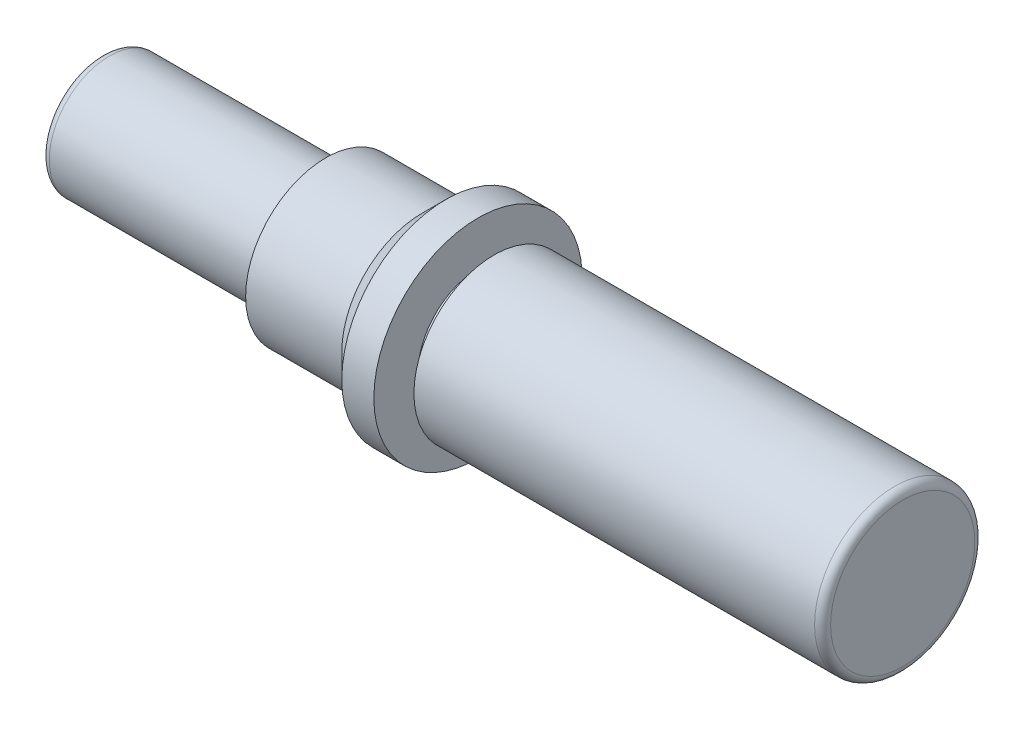
ISO-10303-21;
HEADER;
FILE_DESCRIPTION(('STEP AP214'),'2;1');
FILE_NAME('part.step','',(''),(''),'','','');
FILE_SCHEMA(('AUTOMOTIVE_DESIGN { 1 0 10303 214 1 1 1 1 }'));
ENDSEC;
DATA;
#1=APPLICATION_CONTEXT('core data for automotive mechanical design processes');
#2=APPLICATION_PROTOCOL_DEFINITION('international standard','automotive_design',2000,#1);
#3=PRODUCT_CONTEXT('',#1,'mechanical');
#4=PRODUCT('Part','Part','',(#3));
#5=PRODUCT_RELATED_PRODUCT_CATEGORY('part','',(#4));
#6=PRODUCT_DEFINITION_FORMATION('','',#4);
#7=PRODUCT_DEFINITION_CONTEXT('part definition',#1,'design');
#8=PRODUCT_DEFINITION('design','',#6,#7);
#9=PRODUCT_DEFINITION_SHAPE('','',#8);
#10=(LENGTH_UNIT() NAMED_UNIT(*) SI_UNIT(.MILLI.,.METRE.));
#11=(NAMED_UNIT(*) PLANE_ANGLE_UNIT() SI_UNIT($,.RADIAN.));
#12=(NAMED_UNIT(*) SI_UNIT($,.STERADIAN.) SOLID_ANGLE_UNIT());
#13=UNCERTAINTY_MEASURE_WITH_UNIT(LENGTH_MEASURE(1.E-05),#10,'distance_accuracy_value','');
#14=(GEOMETRIC_REPRESENTATION_CONTEXT(3) GLOBAL_UNCERTAINTY_ASSIGNED_CONTEXT((#13)) GLOBAL_UNIT_ASSIGNED_CONTEXT((#10,
#11,#12)) REPRESENTATION_CONTEXT('',''));
#15=CARTESIAN_POINT('',(0.,0.,0.));
#16=DIRECTION('',(0.,0.,1.));
#17=DIRECTION('',(1.,0.,0.));
#18=AXIS2_PLACEMENT_3D('',#15,#16,#17);
#19=CARTESIAN_POINT('',(-61.6997640195075,9.89779965995193,0.));
#20=DIRECTION('',(1.,0.,0.));
#21=DIRECTION('',(0.,0.,-1.));
#22=AXIS2_PLACEMENT_3D('',#19,#20,#21);
#23=PLANE('',#22);
#24=CARTESIAN_POINT('',(-61.6997640195075,9.89779965995193,0.));
#25=DIRECTION('',(1.,0.,0.));
#26=DIRECTION('',(0.,0.,-1.));
#27=AXIS2_PLACEMENT_3D('',#24,#25,#26);
#28=CIRCLE('',#27,6.5);
#29=CARTESIAN_POINT('',(-61.6997640195075,9.89779965995193,-6.5));
#30=VERTEX_POINT('',#29);
#31=EDGE_CURVE('E49',#30,#30,#28,.F.);
#32=ORIENTED_EDGE('',*,*,#31,.T.);
#33=EDGE_LOOP('',(#32));
#34=FACE_BOUND('',#33,.T.);
#35=ADVANCED_FACE('F41',(#34),#23,.F.);
#36=CARTESIAN_POINT('',(-61.6997640195075,9.89779965995193,0.));
#37=DIRECTION('',(-1.,0.,0.));
#38=DIRECTION('',(0.,0.,1.));
#39=AXIS2_PLACEMENT_3D('',#36,#37,#38);
#40=CYLINDRICAL_SURFACE('',#39,7.5);
#41=CARTESIAN_POINT('',(-60.6997640195075,9.89779965995193,0.));
#42=DIRECTION('',(1.,0.,0.));
#43=DIRECTION('',(0.,0.,-1.));
#44=AXIS2_PLACEMENT_3D('',#41,#42,#43);
#45=CIRCLE('',#44,7.5);
#46=CARTESIAN_POINT('',(-60.6997640195075,9.89779965995193,-7.5));
#47=VERTEX_POINT('',#46);
#48=EDGE_CURVE('E10',#47,#47,#45,.T.);
#49=ORIENTED_EDGE('',*,*,#48,.T.);
#50=EDGE_LOOP('',(#49));
#51=FACE_BOUND('',#50,.T.);
#52=CARTESIAN_POINT('',(-33.6997640195075,9.89779965995193,0.));
#53=DIRECTION('',(-1.,0.,0.));
#54=DIRECTION('',(0.,0.,1.));
#55=AXIS2_PLACEMENT_3D('',#52,#53,#54);
#56=CIRCLE('',#55,7.5);
#57=CARTESIAN_POINT('',(-33.6997640195075,9.89779965995193,7.5));
#58=VERTEX_POINT('',#57);
#59=EDGE_CURVE('E65',#58,#58,#56,.T.);
#60=ORIENTED_EDGE('',*,*,#59,.T.);
#61=EDGE_LOOP('',(#60));
#62=FACE_BOUND('',#61,.T.);
#63=ADVANCED_FACE('F116',(#51,#62),#40,.T.);
#64=CARTESIAN_POINT('',(-33.6997640195075,17.3977996599519,0.));
#65=DIRECTION('',(1.,0.,0.));
#66=DIRECTION('',(0.,0.,-1.));
#67=AXIS2_PLACEMENT_3D('',#64,#65,#66);
#68=PLANE('',#67);
#69=ORIENTED_EDGE('',*,*,#59,.F.);
#70=EDGE_LOOP('',(#69));
#71=FACE_BOUND('',#70,.T.);
#72=CARTESIAN_POINT('',(-33.6997640195075,9.89779965995193,0.));
#73=DIRECTION('',(-1.,0.,0.));
#74=DIRECTION('',(0.,0.,1.));
#75=AXIS2_PLACEMENT_3D('',#72,#73,#74);
#76=CIRCLE('',#75,10.);
#77=CARTESIAN_POINT('',(-33.6997640195075,9.89779965995193,10.));
#78=VERTEX_POINT('',#77);
#79=EDGE_CURVE('E69',#78,#78,#76,.T.);
#80=ORIENTED_EDGE('',*,*,#79,.T.);
#81=EDGE_LOOP('',(#80));
#82=FACE_BOUND('',#81,.T.);
#83=ADVANCED_FACE('F121',(#71,#82),#68,.F.);
#84=CARTESIAN_POINT('',(-61.6997640195075,9.89779965995193,0.));
#85=DIRECTION('',(-1.,0.,0.));
#86=DIRECTION('',(0.,0.,1.));
#87=AXIS2_PLACEMENT_3D('',#84,#85,#86);
#88=CYLINDRICAL_SURFACE('',#87,10.);
#89=ORIENTED_EDGE('',*,*,#79,.F.);
#90=EDGE_LOOP('',(#89));
#91=FACE_BOUND('',#90,.T.);
#92=CARTESIAN_POINT('',(-21.6997640195075,9.89779965995193,0.));
#93=DIRECTION('',(-1.,0.,0.));
#94=DIRECTION('',(0.,0.,1.));
#95=AXIS2_PLACEMENT_3D('',#92,#93,#94);
#96=CIRCLE('',#95,10.);
#97=CARTESIAN_POINT('',(-21.6997640195075,9.89779965995193,10.));
#98=VERTEX_POINT('',#97);
#99=EDGE_CURVE('E73',#98,#98,#96,.T.);
#100=ORIENTED_EDGE('',*,*,#99,.T.);
#101=EDGE_LOOP('',(#100));
#102=FACE_BOUND('',#101,.T.);
#103=ADVANCED_FACE('F217',(#91,#102),#88,.T.);
#104=CARTESIAN_POINT('',(-18.6997640195075,9.89779965995193,0.));
#105=DIRECTION('',(1.,0.,0.));
#106=DIRECTION('',(0.,0.,-1.));
#107=AXIS2_PLACEMENT_3D('',#104,#105,#106);
#108=CONICAL_SURFACE('',#107,13.,0.78539816339745);
#109=ORIENTED_EDGE('',*,*,#99,.F.);
#110=EDGE_LOOP('',(#109));
#111=FACE_BOUND('',#110,.T.);
#112=CARTESIAN_POINT('',(-18.6997640195075,9.89779965995193,0.));
#113=DIRECTION('',(-1.,0.,0.));
#114=DIRECTION('',(0.,0.,1.));
#115=AXIS2_PLACEMENT_3D('',#112,#113,#114);
#116=CIRCLE('',#115,13.);
#117=CARTESIAN_POINT('',(-18.6997640195075,9.89779965995193,13.));
#118=VERTEX_POINT('',#117);
#119=EDGE_CURVE('E77',#118,#118,#116,.T.);
#120=ORIENTED_EDGE('',*,*,#119,.T.);
#121=EDGE_LOOP('',(#120));
#122=FACE_BOUND('',#121,.T.);
#123=ADVANCED_FACE('F206',(#111,#122),#108,.T.);
#124=CARTESIAN_POINT('',(-61.6997640195075,9.89779965995193,0.));
#125=DIRECTION('',(-1.,0.,0.));
#126=DIRECTION('',(0.,0.,1.));
#127=AXIS2_PLACEMENT_3D('',#124,#125,#126);
#128=CYLINDRICAL_SURFACE('',#127,13.);
#129=ORIENTED_EDGE('',*,*,#119,.F.);
#130=EDGE_LOOP('',(#129));
#131=FACE_BOUND('',#130,.T.);
#132=CARTESIAN_POINT('',(-14.6997640195075,9.89779965995193,0.));
#133=DIRECTION('',(-1.,0.,0.));
#134=DIRECTION('',(0.,0.,1.));
#135=AXIS2_PLACEMENT_3D('',#132,#133,#134);
#136=CIRCLE('',#135,13.);
#137=CARTESIAN_POINT('',(-14.6997640195075,9.89779965995193,13.));
#138=VERTEX_POINT('',#137);
#139=EDGE_CURVE('E81',#138,#138,#136,.T.);
#140=ORIENTED_EDGE('',*,*,#139,.T.);
#141=EDGE_LOOP('',(#140));
#142=FACE_BOUND('',#141,.T.);
#143=ADVANCED_FACE('F195',(#131,#142),#128,.T.);
#144=CARTESIAN_POINT('',(-14.6997640195075,22.8977996599519,0.));
#145=DIRECTION('',(-1.,0.,0.));
#146=DIRECTION('',(0.,0.,1.));
#147=AXIS2_PLACEMENT_3D('',#144,#145,#146);
#148=PLANE('',#147);
#149=ORIENTED_EDGE('',*,*,#139,.F.);
#150=EDGE_LOOP('',(#149));
#151=FACE_BOUND('',#150,.T.);
#152=CARTESIAN_POINT('',(-14.6997640195075,9.89779965995193,0.));
#153=DIRECTION('',(-1.,0.,0.));
#154=DIRECTION('',(0.,0.,1.));
#155=AXIS2_PLACEMENT_3D('',#152,#153,#154);
#156=CIRCLE('',#155,7.5);
#157=CARTESIAN_POINT('',(-14.6997640195075,9.89779965995193,7.5));
#158=VERTEX_POINT('',#157);
#159=EDGE_CURVE('E85',#158,#158,#156,.T.);
#160=ORIENTED_EDGE('',*,*,#159,.T.);
#161=EDGE_LOOP('',(#160));
#162=FACE_BOUND('',#161,.T.);
#163=ADVANCED_FACE('F184',(#151,#162),#148,.F.);
#164=CARTESIAN_POINT('',(-61.6997640195075,9.89779965995193,0.));
#165=DIRECTION('',(-1.,0.,0.));
#166=DIRECTION('',(0.,0.,1.));
#167=AXIS2_PLACEMENT_3D('',#164,#165,#166);
#168=CYLINDRICAL_SURFACE('',#167,7.5);
#169=ORIENTED_EDGE('',*,*,#159,.F.);
#170=EDGE_LOOP('',(#169));
#171=FACE_BOUND('',#170,.T.);
#172=CARTESIAN_POINT('',(-12.6997640195075,9.89779965995193,0.));
#173=DIRECTION('',(-1.,0.,0.));
#174=DIRECTION('',(0.,0.,1.));
#175=AXIS2_PLACEMENT_3D('',#172,#173,#174);
#176=CIRCLE('',#175,7.5);
#177=CARTESIAN_POINT('',(-12.6997640195075,9.89779965995193,7.5));
#178=VERTEX_POINT('',#177);
#179=EDGE_CURVE('E89',#178,#178,#176,.T.);
#180=ORIENTED_EDGE('',*,*,#179,.T.);
#181=EDGE_LOOP('',(#180));
#182=FACE_BOUND('',#181,.T.);
#183=ADVANCED_FACE('F112',(#171,#182),#168,.T.);
#184=CARTESIAN_POINT('',(-12.6997640195075,17.3977996599519,0.));
#185=DIRECTION('',(1.,0.,0.));
#186=DIRECTION('',(0.,0.,-1.));
#187=AXIS2_PLACEMENT_3D('',#184,#185,#186);
#188=PLANE('',#187);
#189=ORIENTED_EDGE('',*,*,#179,.F.);
#190=EDGE_LOOP('',(#189));
#191=FACE_BOUND('',#190,.T.);
#192=CARTESIAN_POINT('',(-12.6997640195075,9.89779965995193,0.));
#193=DIRECTION('',(-1.,0.,0.));
#194=DIRECTION('',(0.,0.,1.));
#195=AXIS2_PLACEMENT_3D('',#192,#193,#194);
#196=CIRCLE('',#195,10.);
#197=CARTESIAN_POINT('',(-12.6997640195075,9.89779965995193,10.));
#198=VERTEX_POINT('',#197);
#199=EDGE_CURVE('E93',#198,#198,#196,.T.);
#200=ORIENTED_EDGE('',*,*,#199,.T.);
#201=EDGE_LOOP('',(#200));
#202=FACE_BOUND('',#201,.T.);
#203=ADVANCED_FACE('F98',(#191,#202),#188,.F.);
#204=CARTESIAN_POINT('',(-61.6997640195075,9.89779965995193,0.));
#205=DIRECTION('',(-1.,0.,0.));
#206=DIRECTION('',(0.,0.,1.));
#207=AXIS2_PLACEMENT_3D('',#204,#205,#206);
#208=CYLINDRICAL_SURFACE('',#207,10.);
#209=CARTESIAN_POINT('',(37.3002359804925,9.89779965995193,0.));
#210=DIRECTION('',(-1.,0.,0.));
#211=DIRECTION('',(0.,0.,1.));
#212=AXIS2_PLACEMENT_3D('',#209,#210,#211);
#213=CIRCLE('',#212,10.);
#214=CARTESIAN_POINT('',(37.3002359804925,9.89779965995193,10.));
#215=VERTEX_POINT('',#214);
#216=EDGE_CURVE('E59',#215,#215,#213,.T.);
#217=ORIENTED_EDGE('',*,*,#216,.T.);
#218=EDGE_LOOP('',(#217));
#219=FACE_BOUND('',#218,.T.);
#220=ORIENTED_EDGE('',*,*,#199,.F.);
#221=EDGE_LOOP('',(#220));
#222=FACE_BOUND('',#221,.T.);
#223=ADVANCED_FACE('F100',(#219,#222),#208,.T.);
#224=CARTESIAN_POINT('',(38.3002359804925,19.8977996599519,0.));
#225=DIRECTION('',(-1.,0.,0.));
#226=DIRECTION('',(0.,0.,1.));
#227=AXIS2_PLACEMENT_3D('',#224,#225,#226);
#228=PLANE('',#227);
#229=CARTESIAN_POINT('',(38.3002359804925,9.89779965995193,0.));
#230=DIRECTION('',(-1.,0.,0.));
#231=DIRECTION('',(0.,0.,1.));
#232=AXIS2_PLACEMENT_3D('',#229,#230,#231);
#233=CIRCLE('',#232,9.);
#234=CARTESIAN_POINT('',(38.3002359804925,9.89779965995193,9.));
#235=VERTEX_POINT('',#234);
#236=EDGE_CURVE('E54',#235,#235,#233,.F.);
#237=ORIENTED_EDGE('',*,*,#236,.T.);
#238=EDGE_LOOP('',(#237));
#239=FACE_BOUND('',#238,.T.);
#240=ADVANCED_FACE('F102',(#239),#228,.F.);
#241=CARTESIAN_POINT('',(37.3002359804925,9.89779965995193,0.));
#242=DIRECTION('',(-1.,0.,0.));
#243=DIRECTION('',(0.,0.,1.));
#244=AXIS2_PLACEMENT_3D('',#241,#242,#243);
#245=TOROIDAL_SURFACE('',#244,9.,1.);
#246=ORIENTED_EDGE('',*,*,#236,.F.);
#247=EDGE_LOOP('',(#246));
#248=FACE_BOUND('',#247,.T.);
#249=ORIENTED_EDGE('',*,*,#216,.F.);
#250=EDGE_LOOP('',(#249));
#251=FACE_BOUND('',#250,.T.);
#252=ADVANCED_FACE('F109',(#248,#251),#245,.T.);
#253=CARTESIAN_POINT('',(-60.6997640195075,9.89779965995193,0.));
#254=DIRECTION('',(1.,0.,0.));
#255=DIRECTION('',(0.,0.,-1.));
#256=AXIS2_PLACEMENT_3D('',#253,#254,#255);
#257=TOROIDAL_SURFACE('',#256,6.5,1.);
#258=ORIENTED_EDGE('',*,*,#48,.F.);
#259=EDGE_LOOP('',(#258));
#260=FACE_BOUND('',#259,.T.);
#261=ORIENTED_EDGE('',*,*,#31,.F.);
#262=EDGE_LOOP('',(#261));
#263=FACE_BOUND('',#262,.T.);
#264=ADVANCED_FACE('F43',(#260,#263),#257,.T.);
#265=CLOSED_SHELL('',(#35,#63,#83,#103,#123,#143,#163,#183,#203,#223,#240,#252,#264));
#266=MANIFOLD_SOLID_BREP('B2',#265);
#267=ADVANCED_BREP_SHAPE_REPRESENTATION('',(#18,#266),#14);
#268=SHAPE_DEFINITION_REPRESENTATION(#9,#267);
ENDSEC;
END-ISO-10303-21;
